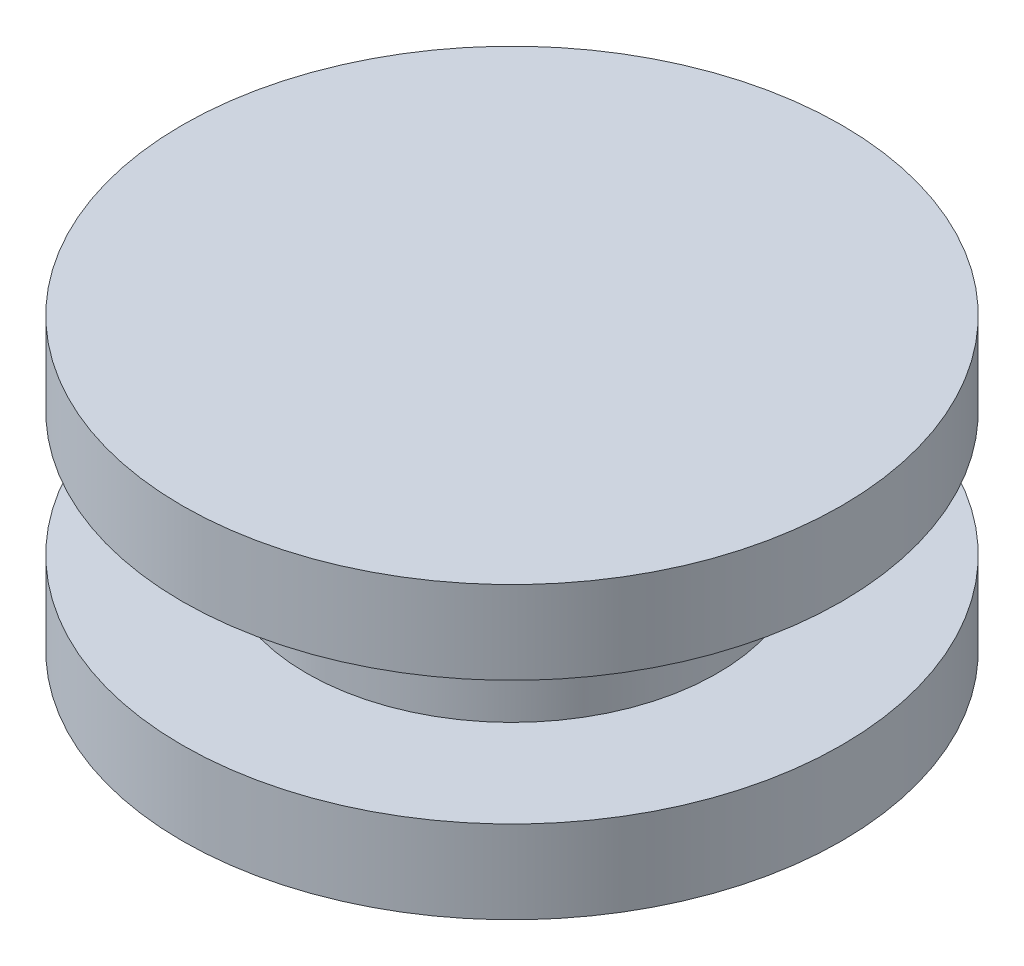
ISO-10303-21;
HEADER;
FILE_DESCRIPTION(('STEP AP214'),'2;1');
FILE_NAME('part.step','',(''),(''),'','','');
FILE_SCHEMA(('AUTOMOTIVE_DESIGN { 1 0 10303 214 1 1 1 1 }'));
ENDSEC;
DATA;
#1=APPLICATION_CONTEXT('core data for automotive mechanical design processes');
#2=APPLICATION_PROTOCOL_DEFINITION('international standard','automotive_design',2000,#1);
#3=PRODUCT_CONTEXT('',#1,'mechanical');
#4=PRODUCT('Part','Part','',(#3));
#5=PRODUCT_RELATED_PRODUCT_CATEGORY('part','',(#4));
#6=PRODUCT_DEFINITION_FORMATION('','',#4);
#7=PRODUCT_DEFINITION_CONTEXT('part definition',#1,'design');
#8=PRODUCT_DEFINITION('design','',#6,#7);
#9=PRODUCT_DEFINITION_SHAPE('','',#8);
#10=(LENGTH_UNIT() NAMED_UNIT(*) SI_UNIT(.MILLI.,.METRE.));
#11=(NAMED_UNIT(*) PLANE_ANGLE_UNIT() SI_UNIT($,.RADIAN.));
#12=(NAMED_UNIT(*) SI_UNIT($,.STERADIAN.) SOLID_ANGLE_UNIT());
#13=UNCERTAINTY_MEASURE_WITH_UNIT(LENGTH_MEASURE(1.E-05),#10,'distance_accuracy_value','');
#14=(GEOMETRIC_REPRESENTATION_CONTEXT(3) GLOBAL_UNCERTAINTY_ASSIGNED_CONTEXT((#13)) GLOBAL_UNIT_ASSIGNED_CONTEXT((#10,
#11,#12)) REPRESENTATION_CONTEXT('',''));
#15=CARTESIAN_POINT('',(0.,0.,0.));
#16=DIRECTION('',(0.,0.,1.));
#17=DIRECTION('',(1.,0.,0.));
#18=AXIS2_PLACEMENT_3D('',#15,#16,#17);
#19=CARTESIAN_POINT('',(0.,0.75,0.));
#20=DIRECTION('',(0.,-1.,0.));
#21=DIRECTION('',(0.,0.,-1.));
#22=AXIS2_PLACEMENT_3D('',#19,#20,#21);
#23=CYLINDRICAL_SURFACE('',#22,2.475);
#24=CARTESIAN_POINT('',(0.,0.75,0.));
#25=DIRECTION('',(0.,1.,0.));
#26=DIRECTION('',(0.,0.,1.));
#27=AXIS2_PLACEMENT_3D('',#24,#25,#26);
#28=CIRCLE('',#27,2.475);
#29=CARTESIAN_POINT('',(0.,0.75,2.475));
#30=VERTEX_POINT('',#29);
#31=EDGE_CURVE('E10',#30,#30,#28,.T.);
#32=ORIENTED_EDGE('',*,*,#31,.F.);
#33=EDGE_LOOP('',(#32));
#34=FACE_BOUND('',#33,.T.);
#35=CARTESIAN_POINT('',(0.,-0.75,0.));
#36=DIRECTION('',(0.,1.,0.));
#37=DIRECTION('',(0.,0.,1.));
#38=AXIS2_PLACEMENT_3D('',#35,#36,#37);
#39=CIRCLE('',#38,2.475);
#40=CARTESIAN_POINT('',(0.,-0.75,2.475));
#41=VERTEX_POINT('',#40);
#42=EDGE_CURVE('E35',#41,#41,#39,.T.);
#43=ORIENTED_EDGE('',*,*,#42,.T.);
#44=EDGE_LOOP('',(#43));
#45=FACE_BOUND('',#44,.T.);
#46=ADVANCED_FACE('F32',(#34,#45),#23,.T.);
#47=CARTESIAN_POINT('',(0.,1.75,0.));
#48=DIRECTION('',(0.,-1.,0.));
#49=DIRECTION('',(0.,0.,-1.));
#50=AXIS2_PLACEMENT_3D('',#47,#48,#49);
#51=CYLINDRICAL_SURFACE('',#50,3.975);
#52=CARTESIAN_POINT('',(0.,1.75,0.));
#53=DIRECTION('',(0.,1.,0.));
#54=DIRECTION('',(0.,0.,1.));
#55=AXIS2_PLACEMENT_3D('',#52,#53,#54);
#56=CIRCLE('',#55,3.975);
#57=CARTESIAN_POINT('',(0.,1.75,3.975));
#58=VERTEX_POINT('',#57);
#59=EDGE_CURVE('E39',#58,#58,#56,.T.);
#60=ORIENTED_EDGE('',*,*,#59,.F.);
#61=EDGE_LOOP('',(#60));
#62=FACE_BOUND('',#61,.T.);
#63=CARTESIAN_POINT('',(0.,0.75,0.));
#64=DIRECTION('',(0.,1.,0.));
#65=DIRECTION('',(0.,0.,1.));
#66=AXIS2_PLACEMENT_3D('',#63,#64,#65);
#67=CIRCLE('',#66,3.975);
#68=CARTESIAN_POINT('',(0.,0.75,3.975));
#69=VERTEX_POINT('',#68);
#70=EDGE_CURVE('E43',#69,#69,#67,.T.);
#71=ORIENTED_EDGE('',*,*,#70,.T.);
#72=EDGE_LOOP('',(#71));
#73=FACE_BOUND('',#72,.T.);
#74=ADVANCED_FACE('F80',(#62,#73),#51,.T.);
#75=CARTESIAN_POINT('',(0.,1.75,0.));
#76=DIRECTION('',(0.,1.,0.));
#77=DIRECTION('',(0.,0.,1.));
#78=AXIS2_PLACEMENT_3D('',#75,#76,#77);
#79=PLANE('',#78);
#80=ORIENTED_EDGE('',*,*,#59,.T.);
#81=EDGE_LOOP('',(#80));
#82=FACE_BOUND('',#81,.T.);
#83=ADVANCED_FACE('F76',(#82),#79,.T.);
#84=CARTESIAN_POINT('',(0.,0.75,0.));
#85=DIRECTION('',(0.,1.,0.));
#86=DIRECTION('',(0.,0.,1.));
#87=AXIS2_PLACEMENT_3D('',#84,#85,#86);
#88=PLANE('',#87);
#89=ORIENTED_EDGE('',*,*,#31,.T.);
#90=EDGE_LOOP('',(#89));
#91=FACE_BOUND('',#90,.T.);
#92=ORIENTED_EDGE('',*,*,#70,.F.);
#93=EDGE_LOOP('',(#92));
#94=FACE_BOUND('',#93,.T.);
#95=ADVANCED_FACE('F68',(#91,#94),#88,.F.);
#96=CARTESIAN_POINT('',(0.,-1.75,0.));
#97=DIRECTION('',(0.,1.,0.));
#98=DIRECTION('',(0.,0.,1.));
#99=AXIS2_PLACEMENT_3D('',#96,#97,#98);
#100=CYLINDRICAL_SURFACE('',#99,3.975);
#101=CARTESIAN_POINT('',(0.,-1.75,0.));
#102=DIRECTION('',(0.,1.,0.));
#103=DIRECTION('',(0.,0.,1.));
#104=AXIS2_PLACEMENT_3D('',#101,#102,#103);
#105=CIRCLE('',#104,3.975);
#106=CARTESIAN_POINT('',(0.,-1.75,3.975));
#107=VERTEX_POINT('',#106);
#108=EDGE_CURVE('E51',#107,#107,#105,.T.);
#109=ORIENTED_EDGE('',*,*,#108,.T.);
#110=EDGE_LOOP('',(#109));
#111=FACE_BOUND('',#110,.T.);
#112=CARTESIAN_POINT('',(0.,-0.75,0.));
#113=DIRECTION('',(0.,1.,0.));
#114=DIRECTION('',(0.,0.,1.));
#115=AXIS2_PLACEMENT_3D('',#112,#113,#114);
#116=CIRCLE('',#115,3.975);
#117=CARTESIAN_POINT('',(0.,-0.75,3.975));
#118=VERTEX_POINT('',#117);
#119=EDGE_CURVE('E48',#118,#118,#116,.T.);
#120=ORIENTED_EDGE('',*,*,#119,.F.);
#121=EDGE_LOOP('',(#120));
#122=FACE_BOUND('',#121,.T.);
#123=ADVANCED_FACE('F66',(#111,#122),#100,.T.);
#124=CARTESIAN_POINT('',(0.,-1.75,0.));
#125=DIRECTION('',(0.,-1.,0.));
#126=DIRECTION('',(0.,0.,1.));
#127=AXIS2_PLACEMENT_3D('',#124,#125,#126);
#128=PLANE('',#127);
#129=ORIENTED_EDGE('',*,*,#108,.F.);
#130=EDGE_LOOP('',(#129));
#131=FACE_BOUND('',#130,.T.);
#132=ADVANCED_FACE('F62',(#131),#128,.T.);
#133=CARTESIAN_POINT('',(0.,-0.75,0.));
#134=DIRECTION('',(0.,-1.,0.));
#135=DIRECTION('',(0.,0.,1.));
#136=AXIS2_PLACEMENT_3D('',#133,#134,#135);
#137=PLANE('',#136);
#138=ORIENTED_EDGE('',*,*,#42,.F.);
#139=EDGE_LOOP('',(#138));
#140=FACE_BOUND('',#139,.T.);
#141=ORIENTED_EDGE('',*,*,#119,.T.);
#142=EDGE_LOOP('',(#141));
#143=FACE_BOUND('',#142,.T.);
#144=ADVANCED_FACE('F59',(#140,#143),#137,.F.);
#145=CLOSED_SHELL('',(#46,#74,#83,#95,#123,#132,#144));
#146=MANIFOLD_SOLID_BREP('B2',#145);
#147=ADVANCED_BREP_SHAPE_REPRESENTATION('',(#18,#146),#14);
#148=SHAPE_DEFINITION_REPRESENTATION(#9,#147);
ENDSEC;
END-ISO-10303-21;
